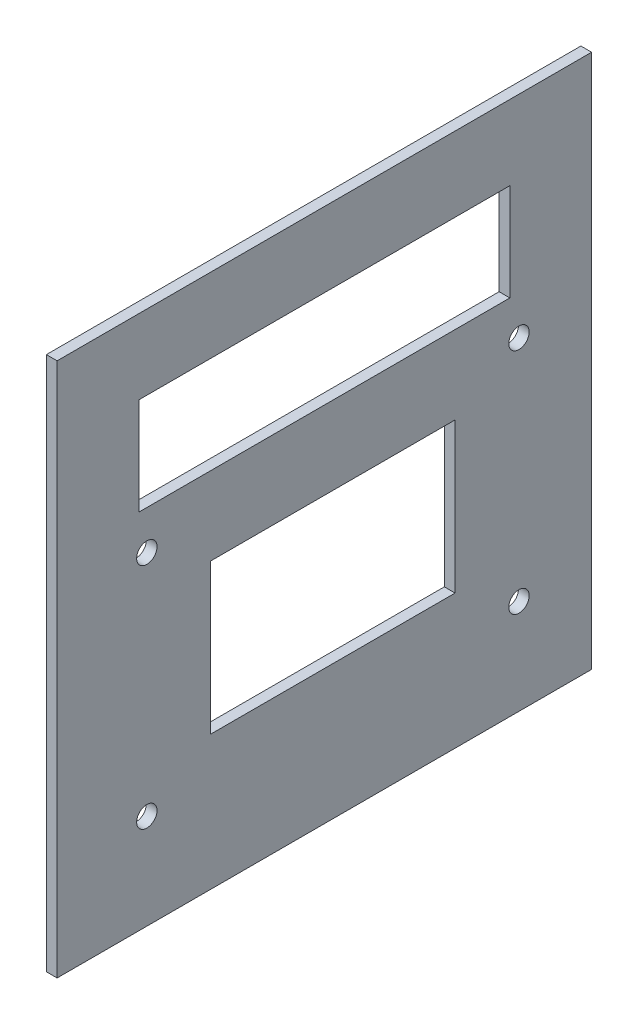
ISO-10303-21;
HEADER;
FILE_DESCRIPTION(('STEP AP214'),'2;1');
FILE_NAME('part.step','',(''),(''),'','','');
FILE_SCHEMA(('AUTOMOTIVE_DESIGN { 1 0 10303 214 1 1 1 1 }'));
ENDSEC;
DATA;
#1=APPLICATION_CONTEXT('core data for automotive mechanical design processes');
#2=APPLICATION_PROTOCOL_DEFINITION('international standard','automotive_design',2000,#1);
#3=PRODUCT_CONTEXT('',#1,'mechanical');
#4=PRODUCT('Part','Part','',(#3));
#5=PRODUCT_RELATED_PRODUCT_CATEGORY('part','',(#4));
#6=PRODUCT_DEFINITION_FORMATION('','',#4);
#7=PRODUCT_DEFINITION_CONTEXT('part definition',#1,'design');
#8=PRODUCT_DEFINITION('design','',#6,#7);
#9=PRODUCT_DEFINITION_SHAPE('','',#8);
#10=(LENGTH_UNIT() NAMED_UNIT(*) SI_UNIT(.MILLI.,.METRE.));
#11=(NAMED_UNIT(*) PLANE_ANGLE_UNIT() SI_UNIT($,.RADIAN.));
#12=(NAMED_UNIT(*) SI_UNIT($,.STERADIAN.) SOLID_ANGLE_UNIT());
#13=UNCERTAINTY_MEASURE_WITH_UNIT(LENGTH_MEASURE(1.E-05),#10,'distance_accuracy_value','');
#14=(GEOMETRIC_REPRESENTATION_CONTEXT(3) GLOBAL_UNCERTAINTY_ASSIGNED_CONTEXT((#13)) GLOBAL_UNIT_ASSIGNED_CONTEXT((#10,
#11,#12)) REPRESENTATION_CONTEXT('',''));
#15=CARTESIAN_POINT('',(0.,0.,0.));
#16=DIRECTION('',(0.,0.,1.));
#17=DIRECTION('',(1.,0.,0.));
#18=AXIS2_PLACEMENT_3D('',#15,#16,#17);
#19=CARTESIAN_POINT('',(3.175,0.,0.));
#20=DIRECTION('',(1.,0.,0.));
#21=DIRECTION('',(0.,0.,-1.));
#22=AXIS2_PLACEMENT_3D('',#19,#20,#21);
#23=PLANE('',#22);
#24=DIRECTION('',(0.,0.,-1.));
#25=VECTOR('',#24,1.);
#26=CARTESIAN_POINT('',(3.175,28.1798470123178,-54.8344982228391));
#27=LINE('',#26,#25);
#28=CARTESIAN_POINT('',(3.175,28.1798470123178,54.8344982228391));
#29=VERTEX_POINT('',#28);
#30=CARTESIAN_POINT('',(3.175,28.1798470123178,-54.8344982228391));
#31=VERTEX_POINT('',#30);
#32=EDGE_CURVE('E614',#29,#31,#27,.T.);
#33=ORIENTED_EDGE('',*,*,#32,.F.);
#34=DIRECTION('',(0.,-1.,0.));
#35=VECTOR('',#34,1.);
#36=CARTESIAN_POINT('',(3.175,28.1798470123178,54.8344982228391));
#37=LINE('',#36,#35);
#38=CARTESIAN_POINT('',(3.175,56.9190804614621,54.8344982228391));
#39=VERTEX_POINT('',#38);
#40=EDGE_CURVE('E287',#39,#29,#37,.T.);
#41=ORIENTED_EDGE('',*,*,#40,.F.);
#42=DIRECTION('',(0.,0.,1.));
#43=VECTOR('',#42,1.);
#44=CARTESIAN_POINT('',(3.175,56.9190804614621,-54.8344982228391));
#45=LINE('',#44,#43);
#46=CARTESIAN_POINT('',(3.175,56.9190804614621,-54.8344982228391));
#47=VERTEX_POINT('',#46);
#48=EDGE_CURVE('E301',#47,#39,#45,.T.);
#49=ORIENTED_EDGE('',*,*,#48,.F.);
#50=DIRECTION('',(0.,1.,0.));
#51=VECTOR('',#50,1.);
#52=CARTESIAN_POINT('',(3.175,28.1798470123178,-54.8344982228391));
#53=LINE('',#52,#51);
#54=EDGE_CURVE('E606',#31,#47,#53,.T.);
#55=ORIENTED_EDGE('',*,*,#54,.F.);
#56=EDGE_LOOP('',(#33,#41,#49,#55));
#57=FACE_BOUND('',#56,.T.);
#58=CARTESIAN_POINT('',(3.175,-50.858309717655,52.4788782228382));
#59=DIRECTION('',(1.,0.,0.));
#60=DIRECTION('',(0.,0.,-1.));
#61=AXIS2_PLACEMENT_3D('',#58,#59,#60);
#62=CIRCLE('',#61,3.01562336065672);
#63=CARTESIAN_POINT('',(3.175,-50.858309717655,49.4632548621815));
#64=VERTEX_POINT('',#63);
#65=EDGE_CURVE('E249',#64,#64,#62,.T.);
#66=ORIENTED_EDGE('',*,*,#65,.F.);
#67=EDGE_LOOP('',(#66));
#68=FACE_BOUND('',#67,.T.);
#69=CARTESIAN_POINT('',(3.175,16.641690282345,-57.5211217771618));
#70=DIRECTION('',(1.,0.,0.));
#71=DIRECTION('',(0.,0.,-1.));
#72=AXIS2_PLACEMENT_3D('',#69,#70,#71);
#73=CIRCLE('',#72,3.01562336065672);
#74=CARTESIAN_POINT('',(3.175,16.641690282345,-60.5367451378185));
#75=VERTEX_POINT('',#74);
#76=EDGE_CURVE('E327',#75,#75,#73,.T.);
#77=ORIENTED_EDGE('',*,*,#76,.F.);
#78=EDGE_LOOP('',(#77));
#79=FACE_BOUND('',#78,.T.);
#80=DIRECTION('',(0.,-1.,0.));
#81=VECTOR('',#80,1.);
#82=CARTESIAN_POINT('',(3.175,-79.,79.));
#83=LINE('',#82,#81);
#84=CARTESIAN_POINT('',(3.175,79.,79.));
#85=VERTEX_POINT('',#84);
#86=CARTESIAN_POINT('',(3.175,-79.,79.));
#87=VERTEX_POINT('',#86);
#88=EDGE_CURVE('E346',#85,#87,#83,.T.);
#89=ORIENTED_EDGE('',*,*,#88,.T.);
#90=DIRECTION('',(0.,0.,-1.));
#91=VECTOR('',#90,1.);
#92=CARTESIAN_POINT('',(3.175,-79.,-79.));
#93=LINE('',#92,#91);
#94=CARTESIAN_POINT('',(3.175,-79.,-79.));
#95=VERTEX_POINT('',#94);
#96=EDGE_CURVE('E350',#87,#95,#93,.T.);
#97=ORIENTED_EDGE('',*,*,#96,.T.);
#98=DIRECTION('',(0.,1.,0.));
#99=VECTOR('',#98,1.);
#100=CARTESIAN_POINT('',(3.175,-79.,-79.));
#101=LINE('',#100,#99);
#102=CARTESIAN_POINT('',(3.175,79.,-79.));
#103=VERTEX_POINT('',#102);
#104=EDGE_CURVE('E357',#95,#103,#101,.T.);
#105=ORIENTED_EDGE('',*,*,#104,.T.);
#106=DIRECTION('',(0.,0.,1.));
#107=VECTOR('',#106,1.);
#108=CARTESIAN_POINT('',(3.175,79.,-79.));
#109=LINE('',#108,#107);
#110=EDGE_CURVE('E271',#103,#85,#109,.T.);
#111=ORIENTED_EDGE('',*,*,#110,.T.);
#112=EDGE_LOOP('',(#89,#97,#105,#111));
#113=FACE_BOUND('',#112,.T.);
#114=CARTESIAN_POINT('',(3.175,-50.858309717655,-57.5211217771618));
#115=DIRECTION('',(1.,0.,0.));
#116=DIRECTION('',(0.,0.,-1.));
#117=AXIS2_PLACEMENT_3D('',#114,#115,#116);
#118=CIRCLE('',#117,3.01562336065672);
#119=CARTESIAN_POINT('',(3.175,-50.858309717655,-60.5367451378185));
#120=VERTEX_POINT('',#119);
#121=EDGE_CURVE('E344',#120,#120,#118,.T.);
#122=ORIENTED_EDGE('',*,*,#121,.F.);
#123=EDGE_LOOP('',(#122));
#124=FACE_BOUND('',#123,.T.);
#125=CARTESIAN_POINT('',(3.175,16.6416902823449,52.4788782228382));
#126=DIRECTION('',(1.,0.,0.));
#127=DIRECTION('',(0.,0.,-1.));
#128=AXIS2_PLACEMENT_3D('',#125,#126,#127);
#129=CIRCLE('',#128,3.01562336065672);
#130=CARTESIAN_POINT('',(3.175,16.6416902823449,49.4632548621815));
#131=VERTEX_POINT('',#130);
#132=EDGE_CURVE('E279',#131,#131,#129,.T.);
#133=ORIENTED_EDGE('',*,*,#132,.F.);
#134=EDGE_LOOP('',(#133));
#135=FACE_BOUND('',#134,.T.);
#136=DIRECTION('',(0.,0.,-1.));
#137=VECTOR('',#136,1.);
#138=CARTESIAN_POINT('',(3.175,-39.2707776129553,-38.6377361250586));
#139=LINE('',#138,#137);
#140=CARTESIAN_POINT('',(3.175,-39.2707776129553,33.595492570735));
#141=VERTEX_POINT('',#140);
#142=CARTESIAN_POINT('',(3.175,-39.2707776129553,-38.6377361250586));
#143=VERTEX_POINT('',#142);
#144=EDGE_CURVE('E168',#141,#143,#139,.T.);
#145=ORIENTED_EDGE('',*,*,#144,.F.);
#146=DIRECTION('',(0.,-1.,0.));
#147=VECTOR('',#146,1.);
#148=CARTESIAN_POINT('',(3.175,-39.2707776129553,33.595492570735));
#149=LINE('',#148,#147);
#150=CARTESIAN_POINT('',(3.175,5.05415817764526,33.595492570735));
#151=VERTEX_POINT('',#150);
#152=EDGE_CURVE('E159',#151,#141,#149,.T.);
#153=ORIENTED_EDGE('',*,*,#152,.F.);
#154=DIRECTION('',(0.,0.,1.));
#155=VECTOR('',#154,1.);
#156=CARTESIAN_POINT('',(3.175,5.05415817764527,-38.6377361250586));
#157=LINE('',#156,#155);
#158=CARTESIAN_POINT('',(3.175,5.05415817764527,-38.6377361250586));
#159=VERTEX_POINT('',#158);
#160=EDGE_CURVE('E186',#159,#151,#157,.T.);
#161=ORIENTED_EDGE('',*,*,#160,.F.);
#162=DIRECTION('',(0.,1.,0.));
#163=VECTOR('',#162,1.);
#164=CARTESIAN_POINT('',(3.175,-39.2707776129553,-38.6377361250586));
#165=LINE('',#164,#163);
#166=EDGE_CURVE('E181',#143,#159,#165,.T.);
#167=ORIENTED_EDGE('',*,*,#166,.F.);
#168=EDGE_LOOP('',(#145,#153,#161,#167));
#169=FACE_BOUND('',#168,.T.);
#170=ADVANCED_FACE('F43',(#57,#68,#79,#113,#124,#135,#169),#23,.T.);
#171=CARTESIAN_POINT('',(0.,0.,0.));
#172=DIRECTION('',(1.,0.,0.));
#173=DIRECTION('',(0.,0.,-1.));
#174=AXIS2_PLACEMENT_3D('',#171,#172,#173);
#175=PLANE('',#174);
#176=CARTESIAN_POINT('',(0.,16.6416902823449,52.4788782228382));
#177=DIRECTION('',(1.,0.,0.));
#178=DIRECTION('',(0.,0.,-1.));
#179=AXIS2_PLACEMENT_3D('',#176,#177,#178);
#180=CIRCLE('',#179,3.01562336065672);
#181=CARTESIAN_POINT('',(0.,16.6416902823449,49.4632548621815));
#182=VERTEX_POINT('',#181);
#183=EDGE_CURVE('E177',#182,#182,#180,.T.);
#184=ORIENTED_EDGE('',*,*,#183,.T.);
#185=EDGE_LOOP('',(#184));
#186=FACE_BOUND('',#185,.T.);
#187=DIRECTION('',(0.,-1.,0.));
#188=VECTOR('',#187,1.);
#189=CARTESIAN_POINT('',(0.,28.1798470123178,54.8344982228391));
#190=LINE('',#189,#188);
#191=CARTESIAN_POINT('',(0.,56.9190804614621,54.8344982228391));
#192=VERTEX_POINT('',#191);
#193=CARTESIAN_POINT('',(0.,28.1798470123178,54.8344982228391));
#194=VERTEX_POINT('',#193);
#195=EDGE_CURVE('E283',#192,#194,#190,.T.);
#196=ORIENTED_EDGE('',*,*,#195,.T.);
#197=DIRECTION('',(0.,0.,-1.));
#198=VECTOR('',#197,1.);
#199=CARTESIAN_POINT('',(0.,28.1798470123178,-54.8344982228391));
#200=LINE('',#199,#198);
#201=CARTESIAN_POINT('',(0.,28.1798470123178,-54.8344982228391));
#202=VERTEX_POINT('',#201);
#203=EDGE_CURVE('E300',#194,#202,#200,.T.);
#204=ORIENTED_EDGE('',*,*,#203,.T.);
#205=DIRECTION('',(0.,1.,0.));
#206=VECTOR('',#205,1.);
#207=CARTESIAN_POINT('',(0.,28.1798470123178,-54.8344982228391));
#208=LINE('',#207,#206);
#209=CARTESIAN_POINT('',(0.,56.9190804614621,-54.8344982228391));
#210=VERTEX_POINT('',#209);
#211=EDGE_CURVE('E308',#202,#210,#208,.T.);
#212=ORIENTED_EDGE('',*,*,#211,.T.);
#213=DIRECTION('',(0.,0.,1.));
#214=VECTOR('',#213,1.);
#215=CARTESIAN_POINT('',(0.,56.9190804614621,-54.8344982228391));
#216=LINE('',#215,#214);
#217=EDGE_CURVE('E313',#210,#192,#216,.T.);
#218=ORIENTED_EDGE('',*,*,#217,.T.);
#219=EDGE_LOOP('',(#196,#204,#212,#218));
#220=FACE_BOUND('',#219,.T.);
#221=DIRECTION('',(0.,-1.,0.));
#222=VECTOR('',#221,1.);
#223=CARTESIAN_POINT('',(0.,-79.,79.));
#224=LINE('',#223,#222);
#225=CARTESIAN_POINT('',(0.,79.,79.));
#226=VERTEX_POINT('',#225);
#227=CARTESIAN_POINT('',(0.,-79.,79.));
#228=VERTEX_POINT('',#227);
#229=EDGE_CURVE('E320',#226,#228,#224,.T.);
#230=ORIENTED_EDGE('',*,*,#229,.F.);
#231=DIRECTION('',(0.,0.,1.));
#232=VECTOR('',#231,1.);
#233=CARTESIAN_POINT('',(0.,79.,-79.));
#234=LINE('',#233,#232);
#235=CARTESIAN_POINT('',(0.,79.,-79.));
#236=VERTEX_POINT('',#235);
#237=EDGE_CURVE('E272',#236,#226,#234,.T.);
#238=ORIENTED_EDGE('',*,*,#237,.F.);
#239=DIRECTION('',(0.,1.,0.));
#240=VECTOR('',#239,1.);
#241=CARTESIAN_POINT('',(0.,-79.,-79.));
#242=LINE('',#241,#240);
#243=CARTESIAN_POINT('',(0.,-79.,-79.));
#244=VERTEX_POINT('',#243);
#245=EDGE_CURVE('E332',#244,#236,#242,.T.);
#246=ORIENTED_EDGE('',*,*,#245,.F.);
#247=DIRECTION('',(0.,0.,-1.));
#248=VECTOR('',#247,1.);
#249=CARTESIAN_POINT('',(0.,-79.,-79.));
#250=LINE('',#249,#248);
#251=EDGE_CURVE('E326',#228,#244,#250,.T.);
#252=ORIENTED_EDGE('',*,*,#251,.F.);
#253=EDGE_LOOP('',(#230,#238,#246,#252));
#254=FACE_BOUND('',#253,.T.);
#255=CARTESIAN_POINT('',(0.,16.641690282345,-57.5211217771618));
#256=DIRECTION('',(1.,0.,0.));
#257=DIRECTION('',(0.,0.,-1.));
#258=AXIS2_PLACEMENT_3D('',#255,#256,#257);
#259=CIRCLE('',#258,3.01562336065672);
#260=CARTESIAN_POINT('',(0.,16.641690282345,-60.5367451378185));
#261=VERTEX_POINT('',#260);
#262=EDGE_CURVE('E338',#261,#261,#259,.T.);
#263=ORIENTED_EDGE('',*,*,#262,.T.);
#264=EDGE_LOOP('',(#263));
#265=FACE_BOUND('',#264,.T.);
#266=CARTESIAN_POINT('',(0.,-50.858309717655,-57.5211217771618));
#267=DIRECTION('',(1.,0.,0.));
#268=DIRECTION('',(0.,0.,-1.));
#269=AXIS2_PLACEMENT_3D('',#266,#267,#268);
#270=CIRCLE('',#269,3.01562336065672);
#271=CARTESIAN_POINT('',(0.,-50.858309717655,-60.5367451378185));
#272=VERTEX_POINT('',#271);
#273=EDGE_CURVE('E387',#272,#272,#270,.T.);
#274=ORIENTED_EDGE('',*,*,#273,.T.);
#275=EDGE_LOOP('',(#274));
#276=FACE_BOUND('',#275,.T.);
#277=CARTESIAN_POINT('',(0.,-50.858309717655,52.4788782228382));
#278=DIRECTION('',(1.,0.,0.));
#279=DIRECTION('',(0.,0.,-1.));
#280=AXIS2_PLACEMENT_3D('',#277,#278,#279);
#281=CIRCLE('',#280,3.01562336065672);
#282=CARTESIAN_POINT('',(0.,-50.858309717655,49.4632548621815));
#283=VERTEX_POINT('',#282);
#284=EDGE_CURVE('E248',#283,#283,#281,.T.);
#285=ORIENTED_EDGE('',*,*,#284,.T.);
#286=EDGE_LOOP('',(#285));
#287=FACE_BOUND('',#286,.T.);
#288=DIRECTION('',(0.,-1.,0.));
#289=VECTOR('',#288,1.);
#290=CARTESIAN_POINT('',(0.,-39.2707776129553,33.595492570735));
#291=LINE('',#290,#289);
#292=CARTESIAN_POINT('',(0.,5.05415817764526,33.595492570735));
#293=VERTEX_POINT('',#292);
#294=CARTESIAN_POINT('',(0.,-39.2707776129553,33.595492570735));
#295=VERTEX_POINT('',#294);
#296=EDGE_CURVE('E74',#293,#295,#291,.T.);
#297=ORIENTED_EDGE('',*,*,#296,.T.);
#298=DIRECTION('',(0.,0.,-1.));
#299=VECTOR('',#298,1.);
#300=CARTESIAN_POINT('',(0.,-39.2707776129553,-38.6377361250586));
#301=LINE('',#300,#299);
#302=CARTESIAN_POINT('',(0.,-39.2707776129553,-38.6377361250586));
#303=VERTEX_POINT('',#302);
#304=EDGE_CURVE('E175',#295,#303,#301,.T.);
#305=ORIENTED_EDGE('',*,*,#304,.T.);
#306=DIRECTION('',(0.,1.,0.));
#307=VECTOR('',#306,1.);
#308=CARTESIAN_POINT('',(0.,-39.2707776129553,-38.6377361250586));
#309=LINE('',#308,#307);
#310=CARTESIAN_POINT('',(0.,5.05415817764527,-38.6377361250586));
#311=VERTEX_POINT('',#310);
#312=EDGE_CURVE('E217',#303,#311,#309,.T.);
#313=ORIENTED_EDGE('',*,*,#312,.T.);
#314=DIRECTION('',(0.,0.,1.));
#315=VECTOR('',#314,1.);
#316=CARTESIAN_POINT('',(0.,5.05415817764527,-38.6377361250586));
#317=LINE('',#316,#315);
#318=EDGE_CURVE('E169',#311,#293,#317,.T.);
#319=ORIENTED_EDGE('',*,*,#318,.T.);
#320=EDGE_LOOP('',(#297,#305,#313,#319));
#321=FACE_BOUND('',#320,.T.);
#322=ADVANCED_FACE('F382',(#186,#220,#254,#265,#276,#287,#321),#175,.F.);
#323=CARTESIAN_POINT('',(3.175,-79.,79.));
#324=DIRECTION('',(0.,0.,-1.));
#325=DIRECTION('',(-1.,0.,0.));
#326=AXIS2_PLACEMENT_3D('',#323,#324,#325);
#327=PLANE('',#326);
#328=ORIENTED_EDGE('',*,*,#229,.T.);
#329=DIRECTION('',(-1.,0.,0.));
#330=VECTOR('',#329,1.);
#331=CARTESIAN_POINT('',(3.175,-79.,79.));
#332=LINE('',#331,#330);
#333=EDGE_CURVE('E12',#87,#228,#332,.T.);
#334=ORIENTED_EDGE('',*,*,#333,.F.);
#335=ORIENTED_EDGE('',*,*,#88,.F.);
#336=DIRECTION('',(-1.,0.,0.));
#337=VECTOR('',#336,1.);
#338=CARTESIAN_POINT('',(3.175,79.,79.));
#339=LINE('',#338,#337);
#340=EDGE_CURVE('E266',#85,#226,#339,.T.);
#341=ORIENTED_EDGE('',*,*,#340,.T.);
#342=EDGE_LOOP('',(#328,#334,#335,#341));
#343=FACE_BOUND('',#342,.T.);
#344=ADVANCED_FACE('F46',(#343),#327,.F.);
#345=CARTESIAN_POINT('',(3.175,-79.,-79.));
#346=DIRECTION('',(0.,1.,0.));
#347=DIRECTION('',(0.,0.,1.));
#348=AXIS2_PLACEMENT_3D('',#345,#346,#347);
#349=PLANE('',#348);
#350=ORIENTED_EDGE('',*,*,#251,.T.);
#351=DIRECTION('',(-1.,0.,0.));
#352=VECTOR('',#351,1.);
#353=CARTESIAN_POINT('',(3.175,-79.,-79.));
#354=LINE('',#353,#352);
#355=EDGE_CURVE('E54',#95,#244,#354,.T.);
#356=ORIENTED_EDGE('',*,*,#355,.F.);
#357=ORIENTED_EDGE('',*,*,#96,.F.);
#358=ORIENTED_EDGE('',*,*,#333,.T.);
#359=EDGE_LOOP('',(#350,#356,#357,#358));
#360=FACE_BOUND('',#359,.T.);
#361=ADVANCED_FACE('F370',(#360),#349,.F.);
#362=CARTESIAN_POINT('',(3.175,-79.,-79.));
#363=DIRECTION('',(0.,0.,1.));
#364=DIRECTION('',(1.,0.,0.));
#365=AXIS2_PLACEMENT_3D('',#362,#363,#364);
#366=PLANE('',#365);
#367=ORIENTED_EDGE('',*,*,#245,.T.);
#368=DIRECTION('',(-1.,0.,0.));
#369=VECTOR('',#368,1.);
#370=CARTESIAN_POINT('',(3.175,79.,-79.));
#371=LINE('',#370,#369);
#372=EDGE_CURVE('E261',#103,#236,#371,.T.);
#373=ORIENTED_EDGE('',*,*,#372,.F.);
#374=ORIENTED_EDGE('',*,*,#104,.F.);
#375=ORIENTED_EDGE('',*,*,#355,.T.);
#376=EDGE_LOOP('',(#367,#373,#374,#375));
#377=FACE_BOUND('',#376,.T.);
#378=ADVANCED_FACE('F373',(#377),#366,.F.);
#379=CARTESIAN_POINT('',(3.175,79.,-79.));
#380=DIRECTION('',(0.,-1.,0.));
#381=DIRECTION('',(0.,0.,-1.));
#382=AXIS2_PLACEMENT_3D('',#379,#380,#381);
#383=PLANE('',#382);
#384=ORIENTED_EDGE('',*,*,#237,.T.);
#385=ORIENTED_EDGE('',*,*,#340,.F.);
#386=ORIENTED_EDGE('',*,*,#110,.F.);
#387=ORIENTED_EDGE('',*,*,#372,.T.);
#388=EDGE_LOOP('',(#384,#385,#386,#387));
#389=FACE_BOUND('',#388,.T.);
#390=ADVANCED_FACE('F378',(#389),#383,.F.);
#391=CARTESIAN_POINT('',(3.175,16.641690282345,-57.5211217771618));
#392=DIRECTION('',(-1.,0.,0.));
#393=DIRECTION('',(0.,0.,1.));
#394=AXIS2_PLACEMENT_3D('',#391,#392,#393);
#395=CYLINDRICAL_SURFACE('',#394,3.01562336065672);
#396=ORIENTED_EDGE('',*,*,#76,.T.);
#397=EDGE_LOOP('',(#396));
#398=FACE_BOUND('',#397,.T.);
#399=ORIENTED_EDGE('',*,*,#262,.F.);
#400=EDGE_LOOP('',(#399));
#401=FACE_BOUND('',#400,.T.);
#402=ADVANCED_FACE('F416',(#398,#401),#395,.F.);
#403=CARTESIAN_POINT('',(3.175,-50.858309717655,-57.5211217771618));
#404=DIRECTION('',(-1.,0.,0.));
#405=DIRECTION('',(0.,0.,1.));
#406=AXIS2_PLACEMENT_3D('',#403,#404,#405);
#407=CYLINDRICAL_SURFACE('',#406,3.01562336065672);
#408=ORIENTED_EDGE('',*,*,#121,.T.);
#409=EDGE_LOOP('',(#408));
#410=FACE_BOUND('',#409,.T.);
#411=ORIENTED_EDGE('',*,*,#273,.F.);
#412=EDGE_LOOP('',(#411));
#413=FACE_BOUND('',#412,.T.);
#414=ADVANCED_FACE('F438',(#410,#413),#407,.F.);
#415=CARTESIAN_POINT('',(3.175,-50.858309717655,52.4788782228382));
#416=DIRECTION('',(-1.,0.,0.));
#417=DIRECTION('',(0.,0.,1.));
#418=AXIS2_PLACEMENT_3D('',#415,#416,#417);
#419=CYLINDRICAL_SURFACE('',#418,3.01562336065672);
#420=ORIENTED_EDGE('',*,*,#65,.T.);
#421=EDGE_LOOP('',(#420));
#422=FACE_BOUND('',#421,.T.);
#423=ORIENTED_EDGE('',*,*,#284,.F.);
#424=EDGE_LOOP('',(#423));
#425=FACE_BOUND('',#424,.T.);
#426=ADVANCED_FACE('F444',(#422,#425),#419,.F.);
#427=CARTESIAN_POINT('',(3.175,28.1798470123178,54.8344982228391));
#428=DIRECTION('',(0.,0.,-1.));
#429=DIRECTION('',(-1.,0.,0.));
#430=AXIS2_PLACEMENT_3D('',#427,#428,#429);
#431=PLANE('',#430);
#432=ORIENTED_EDGE('',*,*,#195,.F.);
#433=DIRECTION('',(-1.,0.,0.));
#434=VECTOR('',#433,1.);
#435=CARTESIAN_POINT('',(3.175,56.9190804614621,54.8344982228391));
#436=LINE('',#435,#434);
#437=EDGE_CURVE('E601',#39,#192,#436,.T.);
#438=ORIENTED_EDGE('',*,*,#437,.F.);
#439=ORIENTED_EDGE('',*,*,#40,.T.);
#440=DIRECTION('',(-1.,0.,0.));
#441=VECTOR('',#440,1.);
#442=CARTESIAN_POINT('',(3.175,28.1798470123178,54.8344982228391));
#443=LINE('',#442,#441);
#444=EDGE_CURVE('E240',#29,#194,#443,.T.);
#445=ORIENTED_EDGE('',*,*,#444,.T.);
#446=EDGE_LOOP('',(#432,#438,#439,#445));
#447=FACE_BOUND('',#446,.T.);
#448=ADVANCED_FACE('F451',(#447),#431,.T.);
#449=CARTESIAN_POINT('',(3.175,28.1798470123178,-54.8344982228391));
#450=DIRECTION('',(0.,1.,0.));
#451=DIRECTION('',(0.,0.,1.));
#452=AXIS2_PLACEMENT_3D('',#449,#450,#451);
#453=PLANE('',#452);
#454=ORIENTED_EDGE('',*,*,#203,.F.);
#455=ORIENTED_EDGE('',*,*,#444,.F.);
#456=ORIENTED_EDGE('',*,*,#32,.T.);
#457=DIRECTION('',(-1.,0.,0.));
#458=VECTOR('',#457,1.);
#459=CARTESIAN_POINT('',(3.175,28.1798470123178,-54.8344982228391));
#460=LINE('',#459,#458);
#461=EDGE_CURVE('E236',#31,#202,#460,.T.);
#462=ORIENTED_EDGE('',*,*,#461,.T.);
#463=EDGE_LOOP('',(#454,#455,#456,#462));
#464=FACE_BOUND('',#463,.T.);
#465=ADVANCED_FACE('F458',(#464),#453,.T.);
#466=CARTESIAN_POINT('',(3.175,28.1798470123178,-54.8344982228391));
#467=DIRECTION('',(0.,0.,1.));
#468=DIRECTION('',(1.,0.,0.));
#469=AXIS2_PLACEMENT_3D('',#466,#467,#468);
#470=PLANE('',#469);
#471=ORIENTED_EDGE('',*,*,#211,.F.);
#472=ORIENTED_EDGE('',*,*,#461,.F.);
#473=ORIENTED_EDGE('',*,*,#54,.T.);
#474=DIRECTION('',(-1.,0.,0.));
#475=VECTOR('',#474,1.);
#476=CARTESIAN_POINT('',(3.175,56.9190804614621,-54.8344982228391));
#477=LINE('',#476,#475);
#478=EDGE_CURVE('E241',#47,#210,#477,.T.);
#479=ORIENTED_EDGE('',*,*,#478,.T.);
#480=EDGE_LOOP('',(#471,#472,#473,#479));
#481=FACE_BOUND('',#480,.T.);
#482=ADVANCED_FACE('F465',(#481),#470,.T.);
#483=CARTESIAN_POINT('',(3.175,56.9190804614621,-54.8344982228391));
#484=DIRECTION('',(0.,-1.,0.));
#485=DIRECTION('',(0.,0.,-1.));
#486=AXIS2_PLACEMENT_3D('',#483,#484,#485);
#487=PLANE('',#486);
#488=ORIENTED_EDGE('',*,*,#217,.F.);
#489=ORIENTED_EDGE('',*,*,#478,.F.);
#490=ORIENTED_EDGE('',*,*,#48,.T.);
#491=ORIENTED_EDGE('',*,*,#437,.T.);
#492=EDGE_LOOP('',(#488,#489,#490,#491));
#493=FACE_BOUND('',#492,.T.);
#494=ADVANCED_FACE('F472',(#493),#487,.T.);
#495=CARTESIAN_POINT('',(3.175,16.6416902823449,52.4788782228382));
#496=DIRECTION('',(-1.,0.,0.));
#497=DIRECTION('',(0.,0.,1.));
#498=AXIS2_PLACEMENT_3D('',#495,#496,#497);
#499=CYLINDRICAL_SURFACE('',#498,3.01562336065672);
#500=ORIENTED_EDGE('',*,*,#132,.T.);
#501=EDGE_LOOP('',(#500));
#502=FACE_BOUND('',#501,.T.);
#503=ORIENTED_EDGE('',*,*,#183,.F.);
#504=EDGE_LOOP('',(#503));
#505=FACE_BOUND('',#504,.T.);
#506=ADVANCED_FACE('F479',(#502,#505),#499,.F.);
#507=CARTESIAN_POINT('',(3.175,-39.2707776129553,33.595492570735));
#508=DIRECTION('',(0.,0.,-1.));
#509=DIRECTION('',(-1.,0.,0.));
#510=AXIS2_PLACEMENT_3D('',#507,#508,#509);
#511=PLANE('',#510);
#512=ORIENTED_EDGE('',*,*,#296,.F.);
#513=DIRECTION('',(-1.,0.,0.));
#514=VECTOR('',#513,1.);
#515=CARTESIAN_POINT('',(3.175,5.05415817764526,33.595492570735));
#516=LINE('',#515,#514);
#517=EDGE_CURVE('E163',#151,#293,#516,.T.);
#518=ORIENTED_EDGE('',*,*,#517,.F.);
#519=ORIENTED_EDGE('',*,*,#152,.T.);
#520=DIRECTION('',(-1.,0.,0.));
#521=VECTOR('',#520,1.);
#522=CARTESIAN_POINT('',(3.175,-39.2707776129553,33.595492570735));
#523=LINE('',#522,#521);
#524=EDGE_CURVE('E162',#141,#295,#523,.T.);
#525=ORIENTED_EDGE('',*,*,#524,.T.);
#526=EDGE_LOOP('',(#512,#518,#519,#525));
#527=FACE_BOUND('',#526,.T.);
#528=ADVANCED_FACE('F161',(#527),#511,.T.);
#529=CARTESIAN_POINT('',(3.175,-39.2707776129553,-38.6377361250586));
#530=DIRECTION('',(0.,1.,0.));
#531=DIRECTION('',(0.,0.,1.));
#532=AXIS2_PLACEMENT_3D('',#529,#530,#531);
#533=PLANE('',#532);
#534=ORIENTED_EDGE('',*,*,#304,.F.);
#535=ORIENTED_EDGE('',*,*,#524,.F.);
#536=ORIENTED_EDGE('',*,*,#144,.T.);
#537=DIRECTION('',(-1.,0.,0.));
#538=VECTOR('',#537,1.);
#539=CARTESIAN_POINT('',(3.175,-39.2707776129553,-38.6377361250586));
#540=LINE('',#539,#538);
#541=EDGE_CURVE('E178',#143,#303,#540,.T.);
#542=ORIENTED_EDGE('',*,*,#541,.T.);
#543=EDGE_LOOP('',(#534,#535,#536,#542));
#544=FACE_BOUND('',#543,.T.);
#545=ADVANCED_FACE('F172',(#544),#533,.T.);
#546=CARTESIAN_POINT('',(3.175,-39.2707776129553,-38.6377361250586));
#547=DIRECTION('',(0.,0.,1.));
#548=DIRECTION('',(1.,0.,0.));
#549=AXIS2_PLACEMENT_3D('',#546,#547,#548);
#550=PLANE('',#549);
#551=ORIENTED_EDGE('',*,*,#312,.F.);
#552=ORIENTED_EDGE('',*,*,#541,.F.);
#553=ORIENTED_EDGE('',*,*,#166,.T.);
#554=DIRECTION('',(-1.,0.,0.));
#555=VECTOR('',#554,1.);
#556=CARTESIAN_POINT('',(3.175,5.05415817764527,-38.6377361250586));
#557=LINE('',#556,#555);
#558=EDGE_CURVE('E63',#159,#311,#557,.T.);
#559=ORIENTED_EDGE('',*,*,#558,.T.);
#560=EDGE_LOOP('',(#551,#552,#553,#559));
#561=FACE_BOUND('',#560,.T.);
#562=ADVANCED_FACE('F393',(#561),#550,.T.);
#563=CARTESIAN_POINT('',(3.175,5.05415817764527,-38.6377361250586));
#564=DIRECTION('',(0.,-1.,0.));
#565=DIRECTION('',(0.,0.,-1.));
#566=AXIS2_PLACEMENT_3D('',#563,#564,#565);
#567=PLANE('',#566);
#568=ORIENTED_EDGE('',*,*,#318,.F.);
#569=ORIENTED_EDGE('',*,*,#558,.F.);
#570=ORIENTED_EDGE('',*,*,#160,.T.);
#571=ORIENTED_EDGE('',*,*,#517,.T.);
#572=EDGE_LOOP('',(#568,#569,#570,#571));
#573=FACE_BOUND('',#572,.T.);
#574=ADVANCED_FACE('F394',(#573),#567,.T.);
#575=CLOSED_SHELL('',(#170,#322,#344,#361,#378,#390,#402,#414,#426,#448,#465,#482,#494,#506,
#528,#545,#562,#574));
#576=MANIFOLD_SOLID_BREP('B2',#575);
#577=ADVANCED_BREP_SHAPE_REPRESENTATION('',(#18,#576),#14);
#578=SHAPE_DEFINITION_REPRESENTATION(#9,#577);
ENDSEC;
END-ISO-10303-21;
